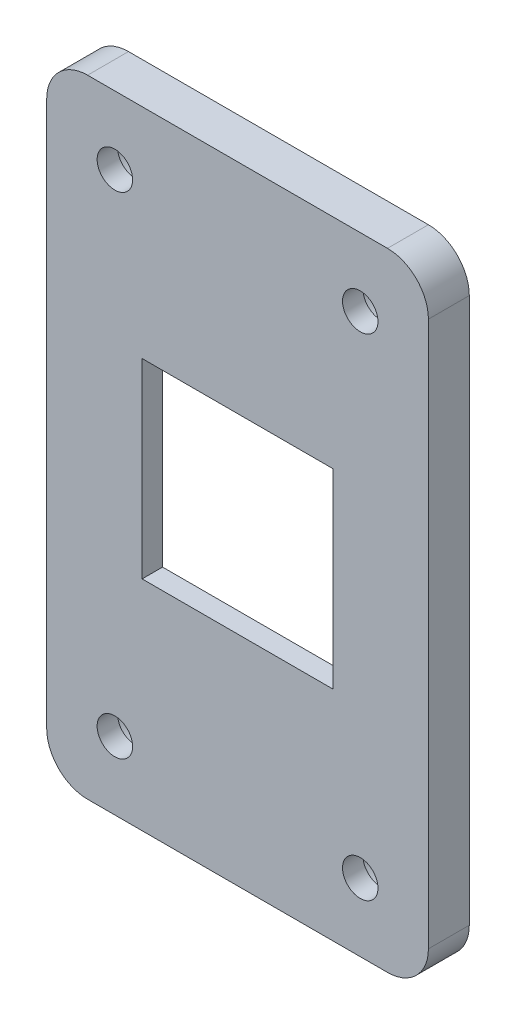
ISO-10303-21;
HEADER;
FILE_DESCRIPTION(('STEP AP214'),'2;1');
FILE_NAME('part.step','',(''),(''),'','','');
FILE_SCHEMA(('AUTOMOTIVE_DESIGN { 1 0 10303 214 1 1 1 1 }'));
ENDSEC;
DATA;
#1=APPLICATION_CONTEXT('core data for automotive mechanical design processes');
#2=APPLICATION_PROTOCOL_DEFINITION('international standard','automotive_design',2000,#1);
#3=PRODUCT_CONTEXT('',#1,'mechanical');
#4=PRODUCT('Part','Part','',(#3));
#5=PRODUCT_RELATED_PRODUCT_CATEGORY('part','',(#4));
#6=PRODUCT_DEFINITION_FORMATION('','',#4);
#7=PRODUCT_DEFINITION_CONTEXT('part definition',#1,'design');
#8=PRODUCT_DEFINITION('design','',#6,#7);
#9=PRODUCT_DEFINITION_SHAPE('','',#8);
#10=(LENGTH_UNIT() NAMED_UNIT(*) SI_UNIT(.MILLI.,.METRE.));
#11=(NAMED_UNIT(*) PLANE_ANGLE_UNIT() SI_UNIT($,.RADIAN.));
#12=(NAMED_UNIT(*) SI_UNIT($,.STERADIAN.) SOLID_ANGLE_UNIT());
#13=UNCERTAINTY_MEASURE_WITH_UNIT(LENGTH_MEASURE(1.E-05),#10,'distance_accuracy_value','');
#14=(GEOMETRIC_REPRESENTATION_CONTEXT(3) GLOBAL_UNCERTAINTY_ASSIGNED_CONTEXT((#13)) GLOBAL_UNIT_ASSIGNED_CONTEXT((#10,
#11,#12)) REPRESENTATION_CONTEXT('',''));
#15=CARTESIAN_POINT('',(0.,0.,0.));
#16=DIRECTION('',(0.,0.,1.));
#17=DIRECTION('',(1.,0.,0.));
#18=AXIS2_PLACEMENT_3D('',#15,#16,#17);
#19=CARTESIAN_POINT('',(0.,0.,0.));
#20=DIRECTION('',(0.,0.,1.));
#21=DIRECTION('',(1.,0.,0.));
#22=AXIS2_PLACEMENT_3D('',#19,#20,#21);
#23=PLANE('',#22);
#24=CARTESIAN_POINT('',(-9.,-18.,0.));
#25=DIRECTION('',(0.,0.,1.));
#26=DIRECTION('',(1.,0.,0.));
#27=AXIS2_PLACEMENT_3D('',#24,#25,#26);
#28=CIRCLE('',#27,2.5);
#29=CARTESIAN_POINT('',(-6.5,-18.,0.));
#30=VERTEX_POINT('',#29);
#31=EDGE_CURVE('E210',#30,#30,#28,.T.);
#32=ORIENTED_EDGE('',*,*,#31,.T.);
#33=EDGE_LOOP('',(#32));
#34=FACE_BOUND('',#33,.T.);
#35=CARTESIAN_POINT('',(-9.,18.,0.));
#36=DIRECTION('',(0.,0.,1.));
#37=DIRECTION('',(1.,0.,0.));
#38=AXIS2_PLACEMENT_3D('',#35,#36,#37);
#39=CIRCLE('',#38,2.5);
#40=CARTESIAN_POINT('',(-6.5,18.,0.));
#41=VERTEX_POINT('',#40);
#42=EDGE_CURVE('E219',#41,#41,#39,.T.);
#43=ORIENTED_EDGE('',*,*,#42,.T.);
#44=EDGE_LOOP('',(#43));
#45=FACE_BOUND('',#44,.T.);
#46=CARTESIAN_POINT('',(9.,18.,0.));
#47=DIRECTION('',(0.,0.,1.));
#48=DIRECTION('',(1.,0.,0.));
#49=AXIS2_PLACEMENT_3D('',#46,#47,#48);
#50=CIRCLE('',#49,2.5);
#51=CARTESIAN_POINT('',(11.5,18.,0.));
#52=VERTEX_POINT('',#51);
#53=EDGE_CURVE('E227',#52,#52,#50,.T.);
#54=ORIENTED_EDGE('',*,*,#53,.T.);
#55=EDGE_LOOP('',(#54));
#56=FACE_BOUND('',#55,.T.);
#57=DIRECTION('',(1.,0.,0.));
#58=VECTOR('',#57,1.);
#59=CARTESIAN_POINT('',(-10.,-9.99999999999999,0.));
#60=LINE('',#59,#58);
#61=CARTESIAN_POINT('',(-10.,-9.99999999999999,0.));
#62=VERTEX_POINT('',#61);
#63=CARTESIAN_POINT('',(9.99999999999999,-9.99999999999999,0.));
#64=VERTEX_POINT('',#63);
#65=EDGE_CURVE('E192',#62,#64,#60,.T.);
#66=ORIENTED_EDGE('',*,*,#65,.T.);
#67=DIRECTION('',(0.,1.,0.));
#68=VECTOR('',#67,1.);
#69=CARTESIAN_POINT('',(9.99999999999999,-9.99999999999999,0.));
#70=LINE('',#69,#68);
#71=CARTESIAN_POINT('',(9.99999999999999,10.,0.));
#72=VERTEX_POINT('',#71);
#73=EDGE_CURVE('E188',#64,#72,#70,.T.);
#74=ORIENTED_EDGE('',*,*,#73,.T.);
#75=DIRECTION('',(1.,0.,0.));
#76=VECTOR('',#75,1.);
#77=CARTESIAN_POINT('',(-10.,10.,0.));
#78=LINE('',#77,#76);
#79=CARTESIAN_POINT('',(-10.,10.,0.));
#80=VERTEX_POINT('',#79);
#81=EDGE_CURVE('E167',#80,#72,#78,.T.);
#82=ORIENTED_EDGE('',*,*,#81,.F.);
#83=DIRECTION('',(0.,1.,0.));
#84=VECTOR('',#83,1.);
#85=CARTESIAN_POINT('',(-10.,-9.99999999999999,0.));
#86=LINE('',#85,#84);
#87=EDGE_CURVE('E180',#62,#80,#86,.T.);
#88=ORIENTED_EDGE('',*,*,#87,.F.);
#89=EDGE_LOOP('',(#66,#74,#82,#88));
#90=FACE_BOUND('',#89,.T.);
#91=CARTESIAN_POINT('',(9.00000000000001,-18.,0.));
#92=DIRECTION('',(0.,0.,1.));
#93=DIRECTION('',(1.,0.,0.));
#94=AXIS2_PLACEMENT_3D('',#91,#92,#93);
#95=CIRCLE('',#94,2.5);
#96=CARTESIAN_POINT('',(11.5,-18.,0.));
#97=VERTEX_POINT('',#96);
#98=EDGE_CURVE('E214',#97,#97,#95,.T.);
#99=ORIENTED_EDGE('',*,*,#98,.T.);
#100=EDGE_LOOP('',(#99));
#101=FACE_BOUND('',#100,.T.);
#102=DIRECTION('',(1.,0.,0.));
#103=VECTOR('',#102,1.);
#104=CARTESIAN_POINT('',(0.,23.,0.));
#105=LINE('',#104,#103);
#106=CARTESIAN_POINT('',(-11.,23.,0.));
#107=VERTEX_POINT('',#106);
#108=CARTESIAN_POINT('',(11.,23.,0.));
#109=VERTEX_POINT('',#108);
#110=EDGE_CURVE('E269',#107,#109,#105,.T.);
#111=ORIENTED_EDGE('',*,*,#110,.T.);
#112=CARTESIAN_POINT('',(11.,20.,0.));
#113=DIRECTION('',(0.,0.,1.));
#114=DIRECTION('',(1.,0.,0.));
#115=AXIS2_PLACEMENT_3D('',#112,#113,#114);
#116=CIRCLE('',#115,3.);
#117=CARTESIAN_POINT('',(14.,20.,0.));
#118=VERTEX_POINT('',#117);
#119=EDGE_CURVE('E357',#109,#118,#116,.F.);
#120=ORIENTED_EDGE('',*,*,#119,.T.);
#121=DIRECTION('',(0.,-1.,0.));
#122=VECTOR('',#121,1.);
#123=CARTESIAN_POINT('',(14.,0.,0.));
#124=LINE('',#123,#122);
#125=CARTESIAN_POINT('',(14.,-20.,0.));
#126=VERTEX_POINT('',#125);
#127=EDGE_CURVE('E302',#118,#126,#124,.T.);
#128=ORIENTED_EDGE('',*,*,#127,.T.);
#129=CARTESIAN_POINT('',(11.,-20.,0.));
#130=DIRECTION('',(0.,0.,1.));
#131=DIRECTION('',(1.,0.,0.));
#132=AXIS2_PLACEMENT_3D('',#129,#130,#131);
#133=CIRCLE('',#132,3.);
#134=CARTESIAN_POINT('',(11.,-23.,0.));
#135=VERTEX_POINT('',#134);
#136=EDGE_CURVE('E354',#126,#135,#133,.F.);
#137=ORIENTED_EDGE('',*,*,#136,.T.);
#138=DIRECTION('',(1.,0.,0.));
#139=VECTOR('',#138,1.);
#140=CARTESIAN_POINT('',(0.,-23.,0.));
#141=LINE('',#140,#139);
#142=CARTESIAN_POINT('',(-11.,-23.,0.));
#143=VERTEX_POINT('',#142);
#144=EDGE_CURVE('E299',#143,#135,#141,.T.);
#145=ORIENTED_EDGE('',*,*,#144,.F.);
#146=CARTESIAN_POINT('',(-11.,-20.,0.));
#147=DIRECTION('',(0.,0.,1.));
#148=DIRECTION('',(1.,0.,0.));
#149=AXIS2_PLACEMENT_3D('',#146,#147,#148);
#150=CIRCLE('',#149,3.);
#151=CARTESIAN_POINT('',(-14.,-20.,0.));
#152=VERTEX_POINT('',#151);
#153=EDGE_CURVE('E351',#143,#152,#150,.F.);
#154=ORIENTED_EDGE('',*,*,#153,.T.);
#155=DIRECTION('',(0.,-1.,0.));
#156=VECTOR('',#155,1.);
#157=CARTESIAN_POINT('',(-14.,0.,0.));
#158=LINE('',#157,#156);
#159=CARTESIAN_POINT('',(-14.,20.,0.));
#160=VERTEX_POINT('',#159);
#161=EDGE_CURVE('E264',#160,#152,#158,.T.);
#162=ORIENTED_EDGE('',*,*,#161,.F.);
#163=CARTESIAN_POINT('',(-11.,20.,0.));
#164=DIRECTION('',(0.,0.,1.));
#165=DIRECTION('',(1.,0.,0.));
#166=AXIS2_PLACEMENT_3D('',#163,#164,#165);
#167=CIRCLE('',#166,3.);
#168=EDGE_CURVE('E348',#160,#107,#167,.F.);
#169=ORIENTED_EDGE('',*,*,#168,.T.);
#170=EDGE_LOOP('',(#111,#120,#128,#137,#145,#154,#162,#169));
#171=FACE_BOUND('',#170,.T.);
#172=ADVANCED_FACE('F47',(#34,#45,#56,#90,#101,#171),#23,.F.);
#173=CARTESIAN_POINT('',(-7.00000000000001,0.,3.));
#174=DIRECTION('',(-1.,0.,0.));
#175=DIRECTION('',(0.,0.,1.));
#176=AXIS2_PLACEMENT_3D('',#173,#174,#175);
#177=PLANE('',#176);
#178=DIRECTION('',(0.,0.,-1.));
#179=VECTOR('',#178,1.);
#180=CARTESIAN_POINT('',(-7.00000000000001,-6.99999999999999,3.));
#181=LINE('',#180,#179);
#182=CARTESIAN_POINT('',(-7.00000000000001,-6.99999999999999,3.));
#183=VERTEX_POINT('',#182);
#184=CARTESIAN_POINT('',(-7.00000000000001,-6.99999999999999,1.5));
#185=VERTEX_POINT('',#184);
#186=EDGE_CURVE('E295',#183,#185,#181,.T.);
#187=ORIENTED_EDGE('',*,*,#186,.T.);
#188=DIRECTION('',(0.,1.,0.));
#189=VECTOR('',#188,1.);
#190=CARTESIAN_POINT('',(-7.00000000000001,0.,1.5));
#191=LINE('',#190,#189);
#192=CARTESIAN_POINT('',(-7.00000000000001,7.00000000000001,1.5));
#193=VERTEX_POINT('',#192);
#194=EDGE_CURVE('E244',#185,#193,#191,.T.);
#195=ORIENTED_EDGE('',*,*,#194,.T.);
#196=DIRECTION('',(0.,0.,-1.));
#197=VECTOR('',#196,1.);
#198=CARTESIAN_POINT('',(-7.00000000000001,7.00000000000001,3.));
#199=LINE('',#198,#197);
#200=CARTESIAN_POINT('',(-7.00000000000001,7.00000000000001,3.));
#201=VERTEX_POINT('',#200);
#202=EDGE_CURVE('E320',#201,#193,#199,.T.);
#203=ORIENTED_EDGE('',*,*,#202,.F.);
#204=DIRECTION('',(0.,1.,0.));
#205=VECTOR('',#204,1.);
#206=CARTESIAN_POINT('',(-7.00000000000001,0.,3.));
#207=LINE('',#206,#205);
#208=EDGE_CURVE('E280',#183,#201,#207,.T.);
#209=ORIENTED_EDGE('',*,*,#208,.F.);
#210=EDGE_LOOP('',(#187,#195,#203,#209));
#211=FACE_BOUND('',#210,.T.);
#212=ADVANCED_FACE('F424',(#211),#177,.F.);
#213=CARTESIAN_POINT('',(0.,7.00000000000001,3.));
#214=DIRECTION('',(0.,1.,0.));
#215=DIRECTION('',(-1.,0.,0.));
#216=AXIS2_PLACEMENT_3D('',#213,#214,#215);
#217=PLANE('',#216);
#218=ORIENTED_EDGE('',*,*,#202,.T.);
#219=DIRECTION('',(1.,0.,0.));
#220=VECTOR('',#219,1.);
#221=CARTESIAN_POINT('',(0.,7.00000000000001,1.5));
#222=LINE('',#221,#220);
#223=CARTESIAN_POINT('',(6.99999999999999,7.00000000000001,1.5));
#224=VERTEX_POINT('',#223);
#225=EDGE_CURVE('E239',#193,#224,#222,.T.);
#226=ORIENTED_EDGE('',*,*,#225,.T.);
#227=DIRECTION('',(0.,0.,-1.));
#228=VECTOR('',#227,1.);
#229=CARTESIAN_POINT('',(6.99999999999999,7.00000000000001,3.));
#230=LINE('',#229,#228);
#231=CARTESIAN_POINT('',(6.99999999999999,7.00000000000001,3.));
#232=VERTEX_POINT('',#231);
#233=EDGE_CURVE('E316',#232,#224,#230,.T.);
#234=ORIENTED_EDGE('',*,*,#233,.F.);
#235=DIRECTION('',(1.,0.,0.));
#236=VECTOR('',#235,1.);
#237=CARTESIAN_POINT('',(0.,7.00000000000001,3.));
#238=LINE('',#237,#236);
#239=EDGE_CURVE('E284',#201,#232,#238,.T.);
#240=ORIENTED_EDGE('',*,*,#239,.F.);
#241=EDGE_LOOP('',(#218,#226,#234,#240));
#242=FACE_BOUND('',#241,.T.);
#243=ADVANCED_FACE('F432',(#242),#217,.F.);
#244=CARTESIAN_POINT('',(6.99999999999999,0.,3.));
#245=DIRECTION('',(-1.,0.,0.));
#246=DIRECTION('',(0.,0.,1.));
#247=AXIS2_PLACEMENT_3D('',#244,#245,#246);
#248=PLANE('',#247);
#249=DIRECTION('',(0.,1.,0.));
#250=VECTOR('',#249,1.);
#251=CARTESIAN_POINT('',(6.99999999999999,0.,1.5));
#252=LINE('',#251,#250);
#253=CARTESIAN_POINT('',(6.99999999999999,-6.99999999999999,1.5));
#254=VERTEX_POINT('',#253);
#255=EDGE_CURVE('E236',#254,#224,#252,.T.);
#256=ORIENTED_EDGE('',*,*,#255,.F.);
#257=DIRECTION('',(0.,0.,-1.));
#258=VECTOR('',#257,1.);
#259=CARTESIAN_POINT('',(6.99999999999999,-6.99999999999999,3.));
#260=LINE('',#259,#258);
#261=CARTESIAN_POINT('',(6.99999999999999,-6.99999999999999,3.));
#262=VERTEX_POINT('',#261);
#263=EDGE_CURVE('E312',#262,#254,#260,.T.);
#264=ORIENTED_EDGE('',*,*,#263,.F.);
#265=DIRECTION('',(0.,1.,0.));
#266=VECTOR('',#265,1.);
#267=CARTESIAN_POINT('',(6.99999999999999,0.,3.));
#268=LINE('',#267,#266);
#269=EDGE_CURVE('E287',#262,#232,#268,.T.);
#270=ORIENTED_EDGE('',*,*,#269,.T.);
#271=ORIENTED_EDGE('',*,*,#233,.T.);
#272=EDGE_LOOP('',(#256,#264,#270,#271));
#273=FACE_BOUND('',#272,.T.);
#274=ADVANCED_FACE('F443',(#273),#248,.T.);
#275=CARTESIAN_POINT('',(-14.,0.,3.));
#276=DIRECTION('',(1.,0.,0.));
#277=DIRECTION('',(0.,0.,-1.));
#278=AXIS2_PLACEMENT_3D('',#275,#276,#277);
#279=PLANE('',#278);
#280=ORIENTED_EDGE('',*,*,#161,.T.);
#281=DIRECTION('',(0.,0.,-1.));
#282=VECTOR('',#281,1.);
#283=CARTESIAN_POINT('',(-14.,-20.,3.));
#284=LINE('',#283,#282);
#285=CARTESIAN_POINT('',(-14.,-20.,3.));
#286=VERTEX_POINT('',#285);
#287=EDGE_CURVE('E11',#152,#286,#284,.F.);
#288=ORIENTED_EDGE('',*,*,#287,.T.);
#289=DIRECTION('',(0.,-1.,0.));
#290=VECTOR('',#289,1.);
#291=CARTESIAN_POINT('',(-14.,0.,3.));
#292=LINE('',#291,#290);
#293=CARTESIAN_POINT('',(-14.,20.,3.));
#294=VERTEX_POINT('',#293);
#295=EDGE_CURVE('E265',#294,#286,#292,.T.);
#296=ORIENTED_EDGE('',*,*,#295,.F.);
#297=DIRECTION('',(0.,0.,-1.));
#298=VECTOR('',#297,1.);
#299=CARTESIAN_POINT('',(-14.,20.,0.));
#300=LINE('',#299,#298);
#301=EDGE_CURVE('E56',#294,#160,#300,.T.);
#302=ORIENTED_EDGE('',*,*,#301,.T.);
#303=EDGE_LOOP('',(#280,#288,#296,#302));
#304=FACE_BOUND('',#303,.T.);
#305=ADVANCED_FACE('F389',(#304),#279,.F.);
#306=CARTESIAN_POINT('',(0.,-23.,3.));
#307=DIRECTION('',(0.,1.,0.));
#308=DIRECTION('',(0.,0.,1.));
#309=AXIS2_PLACEMENT_3D('',#306,#307,#308);
#310=PLANE('',#309);
#311=ORIENTED_EDGE('',*,*,#144,.T.);
#312=DIRECTION('',(0.,0.,-1.));
#313=VECTOR('',#312,1.);
#314=CARTESIAN_POINT('',(11.,-23.,3.));
#315=LINE('',#314,#313);
#316=CARTESIAN_POINT('',(11.,-23.,3.));
#317=VERTEX_POINT('',#316);
#318=EDGE_CURVE('E63',#135,#317,#315,.F.);
#319=ORIENTED_EDGE('',*,*,#318,.T.);
#320=DIRECTION('',(1.,0.,0.));
#321=VECTOR('',#320,1.);
#322=CARTESIAN_POINT('',(0.,-23.,3.));
#323=LINE('',#322,#321);
#324=CARTESIAN_POINT('',(-11.,-23.,3.));
#325=VERTEX_POINT('',#324);
#326=EDGE_CURVE('E268',#325,#317,#323,.T.);
#327=ORIENTED_EDGE('',*,*,#326,.F.);
#328=DIRECTION('',(0.,0.,-1.));
#329=VECTOR('',#328,1.);
#330=CARTESIAN_POINT('',(-11.,-23.,3.));
#331=LINE('',#330,#329);
#332=EDGE_CURVE('E378',#325,#143,#331,.T.);
#333=ORIENTED_EDGE('',*,*,#332,.T.);
#334=EDGE_LOOP('',(#311,#319,#327,#333));
#335=FACE_BOUND('',#334,.T.);
#336=ADVANCED_FACE('F399',(#335),#310,.F.);
#337=CARTESIAN_POINT('',(14.,0.,3.));
#338=DIRECTION('',(1.,0.,0.));
#339=DIRECTION('',(0.,0.,-1.));
#340=AXIS2_PLACEMENT_3D('',#337,#338,#339);
#341=PLANE('',#340);
#342=ORIENTED_EDGE('',*,*,#127,.F.);
#343=DIRECTION('',(0.,0.,-1.));
#344=VECTOR('',#343,1.);
#345=CARTESIAN_POINT('',(14.,20.,3.));
#346=LINE('',#345,#344);
#347=CARTESIAN_POINT('',(14.,20.,3.));
#348=VERTEX_POINT('',#347);
#349=EDGE_CURVE('E364',#118,#348,#346,.F.);
#350=ORIENTED_EDGE('',*,*,#349,.T.);
#351=DIRECTION('',(0.,-1.,0.));
#352=VECTOR('',#351,1.);
#353=CARTESIAN_POINT('',(14.,0.,3.));
#354=LINE('',#353,#352);
#355=CARTESIAN_POINT('',(14.,-20.,3.));
#356=VERTEX_POINT('',#355);
#357=EDGE_CURVE('E272',#348,#356,#354,.T.);
#358=ORIENTED_EDGE('',*,*,#357,.T.);
#359=DIRECTION('',(0.,0.,-1.));
#360=VECTOR('',#359,1.);
#361=CARTESIAN_POINT('',(14.,-20.,0.));
#362=LINE('',#361,#360);
#363=EDGE_CURVE('E360',#356,#126,#362,.T.);
#364=ORIENTED_EDGE('',*,*,#363,.T.);
#365=EDGE_LOOP('',(#342,#350,#358,#364));
#366=FACE_BOUND('',#365,.T.);
#367=ADVANCED_FACE('F409',(#366),#341,.T.);
#368=CARTESIAN_POINT('',(0.,23.,3.));
#369=DIRECTION('',(0.,1.,0.));
#370=DIRECTION('',(0.,0.,1.));
#371=AXIS2_PLACEMENT_3D('',#368,#369,#370);
#372=PLANE('',#371);
#373=DIRECTION('',(1.,0.,0.));
#374=VECTOR('',#373,1.);
#375=CARTESIAN_POINT('',(0.,23.,3.));
#376=LINE('',#375,#374);
#377=CARTESIAN_POINT('',(-11.,23.,3.));
#378=VERTEX_POINT('',#377);
#379=CARTESIAN_POINT('',(11.,23.,3.));
#380=VERTEX_POINT('',#379);
#381=EDGE_CURVE('E276',#378,#380,#376,.T.);
#382=ORIENTED_EDGE('',*,*,#381,.T.);
#383=DIRECTION('',(0.,0.,-1.));
#384=VECTOR('',#383,1.);
#385=CARTESIAN_POINT('',(11.,23.,3.));
#386=LINE('',#385,#384);
#387=EDGE_CURVE('E344',#380,#109,#386,.T.);
#388=ORIENTED_EDGE('',*,*,#387,.T.);
#389=ORIENTED_EDGE('',*,*,#110,.F.);
#390=DIRECTION('',(0.,0.,-1.));
#391=VECTOR('',#390,1.);
#392=CARTESIAN_POINT('',(-11.,23.,3.));
#393=LINE('',#392,#391);
#394=EDGE_CURVE('E341',#107,#378,#393,.F.);
#395=ORIENTED_EDGE('',*,*,#394,.T.);
#396=EDGE_LOOP('',(#382,#388,#389,#395));
#397=FACE_BOUND('',#396,.T.);
#398=ADVANCED_FACE('F416',(#397),#372,.T.);
#399=CARTESIAN_POINT('',(0.,-6.99999999999999,3.));
#400=DIRECTION('',(0.,1.,0.));
#401=DIRECTION('',(-1.,0.,0.));
#402=AXIS2_PLACEMENT_3D('',#399,#400,#401);
#403=PLANE('',#402);
#404=DIRECTION('',(1.,0.,0.));
#405=VECTOR('',#404,1.);
#406=CARTESIAN_POINT('',(0.,-6.99999999999999,1.5));
#407=LINE('',#406,#405);
#408=EDGE_CURVE('E324',#185,#254,#407,.T.);
#409=ORIENTED_EDGE('',*,*,#408,.F.);
#410=ORIENTED_EDGE('',*,*,#186,.F.);
#411=DIRECTION('',(1.,0.,0.));
#412=VECTOR('',#411,1.);
#413=CARTESIAN_POINT('',(0.,-6.99999999999999,3.));
#414=LINE('',#413,#412);
#415=EDGE_CURVE('E291',#183,#262,#414,.T.);
#416=ORIENTED_EDGE('',*,*,#415,.T.);
#417=ORIENTED_EDGE('',*,*,#263,.T.);
#418=EDGE_LOOP('',(#409,#410,#416,#417));
#419=FACE_BOUND('',#418,.T.);
#420=ADVANCED_FACE('F439',(#419),#403,.T.);
#421=CARTESIAN_POINT('',(0.,0.,3.));
#422=DIRECTION('',(0.,0.,1.));
#423=DIRECTION('',(1.,0.,0.));
#424=AXIS2_PLACEMENT_3D('',#421,#422,#423);
#425=PLANE('',#424);
#426=CARTESIAN_POINT('',(9.00000000000001,-18.,3.));
#427=DIRECTION('',(0.,0.,-1.));
#428=DIRECTION('',(-1.,0.,0.));
#429=AXIS2_PLACEMENT_3D('',#426,#427,#428);
#430=CIRCLE('',#429,1.3);
#431=CARTESIAN_POINT('',(7.70000000000001,-18.,3.));
#432=VERTEX_POINT('',#431);
#433=EDGE_CURVE('E248',#432,#432,#430,.T.);
#434=ORIENTED_EDGE('',*,*,#433,.T.);
#435=EDGE_LOOP('',(#434));
#436=FACE_BOUND('',#435,.T.);
#437=CARTESIAN_POINT('',(-9.,-18.,3.));
#438=DIRECTION('',(0.,0.,-1.));
#439=DIRECTION('',(-1.,0.,0.));
#440=AXIS2_PLACEMENT_3D('',#437,#438,#439);
#441=CIRCLE('',#440,1.3);
#442=CARTESIAN_POINT('',(-10.3,-18.,3.));
#443=VERTEX_POINT('',#442);
#444=EDGE_CURVE('E252',#443,#443,#441,.T.);
#445=ORIENTED_EDGE('',*,*,#444,.T.);
#446=EDGE_LOOP('',(#445));
#447=FACE_BOUND('',#446,.T.);
#448=CARTESIAN_POINT('',(9.,18.,3.));
#449=DIRECTION('',(0.,0.,-1.));
#450=DIRECTION('',(-1.,0.,0.));
#451=AXIS2_PLACEMENT_3D('',#448,#449,#450);
#452=CIRCLE('',#451,1.3);
#453=CARTESIAN_POINT('',(7.7,18.,3.));
#454=VERTEX_POINT('',#453);
#455=EDGE_CURVE('E256',#454,#454,#452,.T.);
#456=ORIENTED_EDGE('',*,*,#455,.T.);
#457=EDGE_LOOP('',(#456));
#458=FACE_BOUND('',#457,.T.);
#459=CARTESIAN_POINT('',(-9.,18.,3.));
#460=DIRECTION('',(0.,0.,-1.));
#461=DIRECTION('',(-1.,0.,0.));
#462=AXIS2_PLACEMENT_3D('',#459,#460,#461);
#463=CIRCLE('',#462,1.3);
#464=CARTESIAN_POINT('',(-10.3,18.,3.));
#465=VERTEX_POINT('',#464);
#466=EDGE_CURVE('E260',#465,#465,#463,.T.);
#467=ORIENTED_EDGE('',*,*,#466,.T.);
#468=EDGE_LOOP('',(#467));
#469=FACE_BOUND('',#468,.T.);
#470=ORIENTED_EDGE('',*,*,#357,.F.);
#471=CARTESIAN_POINT('',(11.,20.,3.));
#472=DIRECTION('',(0.,0.,1.));
#473=DIRECTION('',(1.,0.,0.));
#474=AXIS2_PLACEMENT_3D('',#471,#472,#473);
#475=CIRCLE('',#474,3.);
#476=EDGE_CURVE('E375',#348,#380,#475,.T.);
#477=ORIENTED_EDGE('',*,*,#476,.T.);
#478=ORIENTED_EDGE('',*,*,#381,.F.);
#479=CARTESIAN_POINT('',(-11.,20.,3.));
#480=DIRECTION('',(0.,0.,1.));
#481=DIRECTION('',(1.,0.,0.));
#482=AXIS2_PLACEMENT_3D('',#479,#480,#481);
#483=CIRCLE('',#482,3.);
#484=EDGE_CURVE('E367',#378,#294,#483,.T.);
#485=ORIENTED_EDGE('',*,*,#484,.T.);
#486=ORIENTED_EDGE('',*,*,#295,.T.);
#487=CARTESIAN_POINT('',(-11.,-20.,3.));
#488=DIRECTION('',(0.,0.,1.));
#489=DIRECTION('',(1.,0.,0.));
#490=AXIS2_PLACEMENT_3D('',#487,#488,#489);
#491=CIRCLE('',#490,3.);
#492=EDGE_CURVE('E70',#286,#325,#491,.T.);
#493=ORIENTED_EDGE('',*,*,#492,.T.);
#494=ORIENTED_EDGE('',*,*,#326,.T.);
#495=CARTESIAN_POINT('',(11.,-20.,3.));
#496=DIRECTION('',(0.,0.,1.));
#497=DIRECTION('',(1.,0.,0.));
#498=AXIS2_PLACEMENT_3D('',#495,#496,#497);
#499=CIRCLE('',#498,3.);
#500=EDGE_CURVE('E372',#317,#356,#499,.T.);
#501=ORIENTED_EDGE('',*,*,#500,.T.);
#502=EDGE_LOOP('',(#470,#477,#478,#485,#486,#493,#494,#501));
#503=FACE_BOUND('',#502,.T.);
#504=ORIENTED_EDGE('',*,*,#208,.T.);
#505=ORIENTED_EDGE('',*,*,#239,.T.);
#506=ORIENTED_EDGE('',*,*,#269,.F.);
#507=ORIENTED_EDGE('',*,*,#415,.F.);
#508=EDGE_LOOP('',(#504,#505,#506,#507));
#509=FACE_BOUND('',#508,.T.);
#510=ADVANCED_FACE('F402',(#436,#447,#458,#469,#503,#509),#425,.T.);
#511=CARTESIAN_POINT('',(-9.,18.,0.));
#512=DIRECTION('',(0.,0.,-1.));
#513=DIRECTION('',(-1.,0.,0.));
#514=AXIS2_PLACEMENT_3D('',#511,#512,#513);
#515=CYLINDRICAL_SURFACE('',#514,1.3);
#516=CARTESIAN_POINT('',(-9.,18.,1.5));
#517=DIRECTION('',(0.,0.,1.));
#518=DIRECTION('',(1.,0.,0.));
#519=AXIS2_PLACEMENT_3D('',#516,#517,#518);
#520=CIRCLE('',#519,1.3);
#521=CARTESIAN_POINT('',(-7.7,18.,1.5));
#522=VERTEX_POINT('',#521);
#523=EDGE_CURVE('E240',#522,#522,#520,.F.);
#524=ORIENTED_EDGE('',*,*,#523,.T.);
#525=EDGE_LOOP('',(#524));
#526=FACE_BOUND('',#525,.T.);
#527=ORIENTED_EDGE('',*,*,#466,.F.);
#528=EDGE_LOOP('',(#527));
#529=FACE_BOUND('',#528,.T.);
#530=ADVANCED_FACE('F619',(#526,#529),#515,.F.);
#531=CARTESIAN_POINT('',(9.,18.,0.));
#532=DIRECTION('',(0.,0.,-1.));
#533=DIRECTION('',(-1.,0.,0.));
#534=AXIS2_PLACEMENT_3D('',#531,#532,#533);
#535=CYLINDRICAL_SURFACE('',#534,1.3);
#536=CARTESIAN_POINT('',(9.,18.,1.5));
#537=DIRECTION('',(0.,0.,1.));
#538=DIRECTION('',(1.,0.,0.));
#539=AXIS2_PLACEMENT_3D('',#536,#537,#538);
#540=CIRCLE('',#539,1.3);
#541=CARTESIAN_POINT('',(10.3,18.,1.5));
#542=VERTEX_POINT('',#541);
#543=EDGE_CURVE('E332',#542,#542,#540,.F.);
#544=ORIENTED_EDGE('',*,*,#543,.T.);
#545=EDGE_LOOP('',(#544));
#546=FACE_BOUND('',#545,.T.);
#547=ORIENTED_EDGE('',*,*,#455,.F.);
#548=EDGE_LOOP('',(#547));
#549=FACE_BOUND('',#548,.T.);
#550=ADVANCED_FACE('F610',(#546,#549),#535,.F.);
#551=CARTESIAN_POINT('',(-9.,-18.,0.));
#552=DIRECTION('',(0.,0.,-1.));
#553=DIRECTION('',(-1.,0.,0.));
#554=AXIS2_PLACEMENT_3D('',#551,#552,#553);
#555=CYLINDRICAL_SURFACE('',#554,1.3);
#556=CARTESIAN_POINT('',(-9.,-18.,1.5));
#557=DIRECTION('',(0.,0.,1.));
#558=DIRECTION('',(1.,0.,0.));
#559=AXIS2_PLACEMENT_3D('',#556,#557,#558);
#560=CIRCLE('',#559,1.3);
#561=CARTESIAN_POINT('',(-7.7,-18.,1.5));
#562=VERTEX_POINT('',#561);
#563=EDGE_CURVE('E328',#562,#562,#560,.F.);
#564=ORIENTED_EDGE('',*,*,#563,.T.);
#565=EDGE_LOOP('',(#564));
#566=FACE_BOUND('',#565,.T.);
#567=ORIENTED_EDGE('',*,*,#444,.F.);
#568=EDGE_LOOP('',(#567));
#569=FACE_BOUND('',#568,.T.);
#570=ADVANCED_FACE('F601',(#566,#569),#555,.F.);
#571=CARTESIAN_POINT('',(9.00000000000001,-18.,0.));
#572=DIRECTION('',(0.,0.,-1.));
#573=DIRECTION('',(-1.,0.,0.));
#574=AXIS2_PLACEMENT_3D('',#571,#572,#573);
#575=CYLINDRICAL_SURFACE('',#574,1.3);
#576=CARTESIAN_POINT('',(9.00000000000001,-18.,1.5));
#577=DIRECTION('',(0.,0.,1.));
#578=DIRECTION('',(1.,0.,0.));
#579=AXIS2_PLACEMENT_3D('',#576,#577,#578);
#580=CIRCLE('',#579,1.3);
#581=CARTESIAN_POINT('',(10.3,-18.,1.5));
#582=VERTEX_POINT('',#581);
#583=EDGE_CURVE('E232',#582,#582,#580,.F.);
#584=ORIENTED_EDGE('',*,*,#583,.T.);
#585=EDGE_LOOP('',(#584));
#586=FACE_BOUND('',#585,.T.);
#587=ORIENTED_EDGE('',*,*,#433,.F.);
#588=EDGE_LOOP('',(#587));
#589=FACE_BOUND('',#588,.T.);
#590=ADVANCED_FACE('F592',(#586,#589),#575,.F.);
#591=CARTESIAN_POINT('',(0.,0.,1.5));
#592=DIRECTION('',(0.,0.,1.));
#593=DIRECTION('',(1.,0.,0.));
#594=AXIS2_PLACEMENT_3D('',#591,#592,#593);
#595=PLANE('',#594);
#596=CARTESIAN_POINT('',(9.00000000000001,-18.,1.5));
#597=DIRECTION('',(0.,0.,1.));
#598=DIRECTION('',(1.,0.,0.));
#599=AXIS2_PLACEMENT_3D('',#596,#597,#598);
#600=CIRCLE('',#599,2.5);
#601=CARTESIAN_POINT('',(11.5,-18.,1.5));
#602=VERTEX_POINT('',#601);
#603=EDGE_CURVE('E228',#602,#602,#600,.T.);
#604=ORIENTED_EDGE('',*,*,#603,.F.);
#605=EDGE_LOOP('',(#604));
#606=FACE_BOUND('',#605,.T.);
#607=ORIENTED_EDGE('',*,*,#583,.F.);
#608=EDGE_LOOP('',(#607));
#609=FACE_BOUND('',#608,.T.);
#610=ADVANCED_FACE('F583',(#606,#609),#595,.F.);
#611=CARTESIAN_POINT('',(9.00000000000001,-18.,1.5));
#612=DIRECTION('',(0.,0.,-1.));
#613=DIRECTION('',(-1.,0.,0.));
#614=AXIS2_PLACEMENT_3D('',#611,#612,#613);
#615=CYLINDRICAL_SURFACE('',#614,2.5);
#616=ORIENTED_EDGE('',*,*,#603,.T.);
#617=EDGE_LOOP('',(#616));
#618=FACE_BOUND('',#617,.T.);
#619=ORIENTED_EDGE('',*,*,#98,.F.);
#620=EDGE_LOOP('',(#619));
#621=FACE_BOUND('',#620,.T.);
#622=ADVANCED_FACE('F574',(#618,#621),#615,.F.);
#623=CARTESIAN_POINT('',(0.,0.,1.5));
#624=DIRECTION('',(0.,0.,1.));
#625=DIRECTION('',(1.,0.,0.));
#626=AXIS2_PLACEMENT_3D('',#623,#624,#625);
#627=PLANE('',#626);
#628=CARTESIAN_POINT('',(-9.,-18.,1.5));
#629=DIRECTION('',(0.,0.,1.));
#630=DIRECTION('',(1.,0.,0.));
#631=AXIS2_PLACEMENT_3D('',#628,#629,#630);
#632=CIRCLE('',#631,2.5);
#633=CARTESIAN_POINT('',(-6.5,-18.,1.5));
#634=VERTEX_POINT('',#633);
#635=EDGE_CURVE('E215',#634,#634,#632,.T.);
#636=ORIENTED_EDGE('',*,*,#635,.F.);
#637=EDGE_LOOP('',(#636));
#638=FACE_BOUND('',#637,.T.);
#639=ORIENTED_EDGE('',*,*,#563,.F.);
#640=EDGE_LOOP('',(#639));
#641=FACE_BOUND('',#640,.T.);
#642=ADVANCED_FACE('F565',(#638,#641),#627,.F.);
#643=CARTESIAN_POINT('',(-9.,-18.,1.5));
#644=DIRECTION('',(0.,0.,-1.));
#645=DIRECTION('',(-1.,0.,0.));
#646=AXIS2_PLACEMENT_3D('',#643,#644,#645);
#647=CYLINDRICAL_SURFACE('',#646,2.5);
#648=ORIENTED_EDGE('',*,*,#635,.T.);
#649=EDGE_LOOP('',(#648));
#650=FACE_BOUND('',#649,.T.);
#651=ORIENTED_EDGE('',*,*,#31,.F.);
#652=EDGE_LOOP('',(#651));
#653=FACE_BOUND('',#652,.T.);
#654=ADVANCED_FACE('F556',(#650,#653),#647,.F.);
#655=CARTESIAN_POINT('',(0.,0.,1.5));
#656=DIRECTION('',(0.,0.,1.));
#657=DIRECTION('',(1.,0.,0.));
#658=AXIS2_PLACEMENT_3D('',#655,#656,#657);
#659=PLANE('',#658);
#660=CARTESIAN_POINT('',(9.,18.,1.5));
#661=DIRECTION('',(0.,0.,1.));
#662=DIRECTION('',(1.,0.,0.));
#663=AXIS2_PLACEMENT_3D('',#660,#661,#662);
#664=CIRCLE('',#663,2.5);
#665=CARTESIAN_POINT('',(11.5,18.,1.5));
#666=VERTEX_POINT('',#665);
#667=EDGE_CURVE('E198',#666,#666,#664,.T.);
#668=ORIENTED_EDGE('',*,*,#667,.F.);
#669=EDGE_LOOP('',(#668));
#670=FACE_BOUND('',#669,.T.);
#671=ORIENTED_EDGE('',*,*,#543,.F.);
#672=EDGE_LOOP('',(#671));
#673=FACE_BOUND('',#672,.T.);
#674=ADVANCED_FACE('F547',(#670,#673),#659,.F.);
#675=CARTESIAN_POINT('',(9.,18.,1.5));
#676=DIRECTION('',(0.,0.,-1.));
#677=DIRECTION('',(-1.,0.,0.));
#678=AXIS2_PLACEMENT_3D('',#675,#676,#677);
#679=CYLINDRICAL_SURFACE('',#678,2.5);
#680=ORIENTED_EDGE('',*,*,#667,.T.);
#681=EDGE_LOOP('',(#680));
#682=FACE_BOUND('',#681,.T.);
#683=ORIENTED_EDGE('',*,*,#53,.F.);
#684=EDGE_LOOP('',(#683));
#685=FACE_BOUND('',#684,.T.);
#686=ADVANCED_FACE('F538',(#682,#685),#679,.F.);
#687=CARTESIAN_POINT('',(0.,0.,1.5));
#688=DIRECTION('',(0.,0.,1.));
#689=DIRECTION('',(1.,0.,0.));
#690=AXIS2_PLACEMENT_3D('',#687,#688,#689);
#691=PLANE('',#690);
#692=CARTESIAN_POINT('',(-9.,18.,1.5));
#693=DIRECTION('',(0.,0.,1.));
#694=DIRECTION('',(1.,0.,0.));
#695=AXIS2_PLACEMENT_3D('',#692,#693,#694);
#696=CIRCLE('',#695,2.5);
#697=CARTESIAN_POINT('',(-6.5,18.,1.5));
#698=VERTEX_POINT('',#697);
#699=EDGE_CURVE('E223',#698,#698,#696,.T.);
#700=ORIENTED_EDGE('',*,*,#699,.F.);
#701=EDGE_LOOP('',(#700));
#702=FACE_BOUND('',#701,.T.);
#703=ORIENTED_EDGE('',*,*,#523,.F.);
#704=EDGE_LOOP('',(#703));
#705=FACE_BOUND('',#704,.T.);
#706=ADVANCED_FACE('F529',(#702,#705),#691,.F.);
#707=CARTESIAN_POINT('',(-9.,18.,1.5));
#708=DIRECTION('',(0.,0.,-1.));
#709=DIRECTION('',(-1.,0.,0.));
#710=AXIS2_PLACEMENT_3D('',#707,#708,#709);
#711=CYLINDRICAL_SURFACE('',#710,2.5);
#712=ORIENTED_EDGE('',*,*,#699,.T.);
#713=EDGE_LOOP('',(#712));
#714=FACE_BOUND('',#713,.T.);
#715=ORIENTED_EDGE('',*,*,#42,.F.);
#716=EDGE_LOOP('',(#715));
#717=FACE_BOUND('',#716,.T.);
#718=ADVANCED_FACE('F520',(#714,#717),#711,.F.);
#719=CARTESIAN_POINT('',(0.,0.,1.5));
#720=DIRECTION('',(0.,0.,1.));
#721=DIRECTION('',(1.,0.,0.));
#722=AXIS2_PLACEMENT_3D('',#719,#720,#721);
#723=PLANE('',#722);
#724=DIRECTION('',(1.,0.,0.));
#725=VECTOR('',#724,1.);
#726=CARTESIAN_POINT('',(-10.,-9.99999999999999,1.5));
#727=LINE('',#726,#725);
#728=CARTESIAN_POINT('',(-10.,-9.99999999999999,1.5));
#729=VERTEX_POINT('',#728);
#730=CARTESIAN_POINT('',(9.99999999999999,-9.99999999999999,1.5));
#731=VERTEX_POINT('',#730);
#732=EDGE_CURVE('E185',#729,#731,#727,.T.);
#733=ORIENTED_EDGE('',*,*,#732,.F.);
#734=DIRECTION('',(0.,1.,0.));
#735=VECTOR('',#734,1.);
#736=CARTESIAN_POINT('',(-10.,-9.99999999999999,1.5));
#737=LINE('',#736,#735);
#738=CARTESIAN_POINT('',(-10.,10.,1.5));
#739=VERTEX_POINT('',#738);
#740=EDGE_CURVE('E199',#729,#739,#737,.T.);
#741=ORIENTED_EDGE('',*,*,#740,.T.);
#742=DIRECTION('',(1.,0.,0.));
#743=VECTOR('',#742,1.);
#744=CARTESIAN_POINT('',(-10.,10.,1.5));
#745=LINE('',#744,#743);
#746=CARTESIAN_POINT('',(9.99999999999999,10.,1.5));
#747=VERTEX_POINT('',#746);
#748=EDGE_CURVE('E170',#739,#747,#745,.T.);
#749=ORIENTED_EDGE('',*,*,#748,.T.);
#750=DIRECTION('',(0.,1.,0.));
#751=VECTOR('',#750,1.);
#752=CARTESIAN_POINT('',(9.99999999999999,-9.99999999999999,1.5));
#753=LINE('',#752,#751);
#754=EDGE_CURVE('E204',#731,#747,#753,.T.);
#755=ORIENTED_EDGE('',*,*,#754,.F.);
#756=EDGE_LOOP('',(#733,#741,#749,#755));
#757=FACE_BOUND('',#756,.T.);
#758=ORIENTED_EDGE('',*,*,#408,.T.);
#759=ORIENTED_EDGE('',*,*,#255,.T.);
#760=ORIENTED_EDGE('',*,*,#225,.F.);
#761=ORIENTED_EDGE('',*,*,#194,.F.);
#762=EDGE_LOOP('',(#758,#759,#760,#761));
#763=FACE_BOUND('',#762,.T.);
#764=ADVANCED_FACE('F511',(#757,#763),#723,.F.);
#765=CARTESIAN_POINT('',(-10.,-9.99999999999999,1.5));
#766=DIRECTION('',(0.,1.,0.));
#767=DIRECTION('',(-1.,0.,0.));
#768=AXIS2_PLACEMENT_3D('',#765,#766,#767);
#769=PLANE('',#768);
#770=ORIENTED_EDGE('',*,*,#65,.F.);
#771=DIRECTION('',(0.,0.,-1.));
#772=VECTOR('',#771,1.);
#773=CARTESIAN_POINT('',(-10.,-9.99999999999999,1.5));
#774=LINE('',#773,#772);
#775=EDGE_CURVE('E175',#729,#62,#774,.T.);
#776=ORIENTED_EDGE('',*,*,#775,.F.);
#777=ORIENTED_EDGE('',*,*,#732,.T.);
#778=DIRECTION('',(0.,0.,-1.));
#779=VECTOR('',#778,1.);
#780=CARTESIAN_POINT('',(9.99999999999999,-9.99999999999999,1.5));
#781=LINE('',#780,#779);
#782=EDGE_CURVE('E745',#731,#64,#781,.T.);
#783=ORIENTED_EDGE('',*,*,#782,.T.);
#784=EDGE_LOOP('',(#770,#776,#777,#783));
#785=FACE_BOUND('',#784,.T.);
#786=ADVANCED_FACE('F502',(#785),#769,.T.);
#787=CARTESIAN_POINT('',(9.99999999999999,-9.99999999999999,1.5));
#788=DIRECTION('',(-1.,0.,0.));
#789=DIRECTION('',(0.,0.,1.));
#790=AXIS2_PLACEMENT_3D('',#787,#788,#789);
#791=PLANE('',#790);
#792=ORIENTED_EDGE('',*,*,#73,.F.);
#793=ORIENTED_EDGE('',*,*,#782,.F.);
#794=ORIENTED_EDGE('',*,*,#754,.T.);
#795=DIRECTION('',(0.,0.,-1.));
#796=VECTOR('',#795,1.);
#797=CARTESIAN_POINT('',(9.99999999999999,10.,1.5));
#798=LINE('',#797,#796);
#799=EDGE_CURVE('E176',#747,#72,#798,.T.);
#800=ORIENTED_EDGE('',*,*,#799,.T.);
#801=EDGE_LOOP('',(#792,#793,#794,#800));
#802=FACE_BOUND('',#801,.T.);
#803=ADVANCED_FACE('F494',(#802),#791,.T.);
#804=CARTESIAN_POINT('',(-10.,10.,1.5));
#805=DIRECTION('',(0.,1.,0.));
#806=DIRECTION('',(0.,0.,1.));
#807=AXIS2_PLACEMENT_3D('',#804,#805,#806);
#808=PLANE('',#807);
#809=ORIENTED_EDGE('',*,*,#81,.T.);
#810=ORIENTED_EDGE('',*,*,#799,.F.);
#811=ORIENTED_EDGE('',*,*,#748,.F.);
#812=DIRECTION('',(0.,0.,-1.));
#813=VECTOR('',#812,1.);
#814=CARTESIAN_POINT('',(-10.,10.,1.5));
#815=LINE('',#814,#813);
#816=EDGE_CURVE('E162',#739,#80,#815,.T.);
#817=ORIENTED_EDGE('',*,*,#816,.T.);
#818=EDGE_LOOP('',(#809,#810,#811,#817));
#819=FACE_BOUND('',#818,.T.);
#820=ADVANCED_FACE('F164',(#819),#808,.F.);
#821=CARTESIAN_POINT('',(-10.,-9.99999999999999,1.5));
#822=DIRECTION('',(-1.,0.,0.));
#823=DIRECTION('',(0.,0.,1.));
#824=AXIS2_PLACEMENT_3D('',#821,#822,#823);
#825=PLANE('',#824);
#826=ORIENTED_EDGE('',*,*,#87,.T.);
#827=ORIENTED_EDGE('',*,*,#816,.F.);
#828=ORIENTED_EDGE('',*,*,#740,.F.);
#829=ORIENTED_EDGE('',*,*,#775,.T.);
#830=EDGE_LOOP('',(#826,#827,#828,#829));
#831=FACE_BOUND('',#830,.T.);
#832=ADVANCED_FACE('F181',(#831),#825,.F.);
#833=CARTESIAN_POINT('',(11.,20.,3.));
#834=DIRECTION('',(0.,0.,-1.));
#835=DIRECTION('',(-1.,0.,0.));
#836=AXIS2_PLACEMENT_3D('',#833,#834,#835);
#837=CYLINDRICAL_SURFACE('',#836,3.);
#838=ORIENTED_EDGE('',*,*,#476,.F.);
#839=ORIENTED_EDGE('',*,*,#349,.F.);
#840=ORIENTED_EDGE('',*,*,#119,.F.);
#841=ORIENTED_EDGE('',*,*,#387,.F.);
#842=EDGE_LOOP('',(#838,#839,#840,#841));
#843=FACE_BOUND('',#842,.T.);
#844=ADVANCED_FACE('F414',(#843),#837,.T.);
#845=CARTESIAN_POINT('',(11.,-20.,3.));
#846=DIRECTION('',(0.,0.,1.));
#847=DIRECTION('',(1.,0.,0.));
#848=AXIS2_PLACEMENT_3D('',#845,#846,#847);
#849=CYLINDRICAL_SURFACE('',#848,3.);
#850=ORIENTED_EDGE('',*,*,#500,.F.);
#851=ORIENTED_EDGE('',*,*,#318,.F.);
#852=ORIENTED_EDGE('',*,*,#136,.F.);
#853=ORIENTED_EDGE('',*,*,#363,.F.);
#854=EDGE_LOOP('',(#850,#851,#852,#853));
#855=FACE_BOUND('',#854,.T.);
#856=ADVANCED_FACE('F406',(#855),#849,.T.);
#857=CARTESIAN_POINT('',(-11.,-20.,3.));
#858=DIRECTION('',(0.,0.,-1.));
#859=DIRECTION('',(-1.,0.,0.));
#860=AXIS2_PLACEMENT_3D('',#857,#858,#859);
#861=CYLINDRICAL_SURFACE('',#860,3.);
#862=ORIENTED_EDGE('',*,*,#492,.F.);
#863=ORIENTED_EDGE('',*,*,#287,.F.);
#864=ORIENTED_EDGE('',*,*,#153,.F.);
#865=ORIENTED_EDGE('',*,*,#332,.F.);
#866=EDGE_LOOP('',(#862,#863,#864,#865));
#867=FACE_BOUND('',#866,.T.);
#868=ADVANCED_FACE('F398',(#867),#861,.T.);
#869=CARTESIAN_POINT('',(-11.,20.,3.));
#870=DIRECTION('',(0.,0.,1.));
#871=DIRECTION('',(1.,0.,0.));
#872=AXIS2_PLACEMENT_3D('',#869,#870,#871);
#873=CYLINDRICAL_SURFACE('',#872,3.);
#874=ORIENTED_EDGE('',*,*,#484,.F.);
#875=ORIENTED_EDGE('',*,*,#394,.F.);
#876=ORIENTED_EDGE('',*,*,#168,.F.);
#877=ORIENTED_EDGE('',*,*,#301,.F.);
#878=EDGE_LOOP('',(#874,#875,#876,#877));
#879=FACE_BOUND('',#878,.T.);
#880=ADVANCED_FACE('F49',(#879),#873,.T.);
#881=CLOSED_SHELL('',(#172,#212,#243,#274,#305,#336,#367,#398,#420,#510,#530,#550,#570,#590,
#610,#622,#642,#654,#674,#686,#706,#718,#764,#786,#803,#820,#832,#844,#856,#868,#880));
#882=MANIFOLD_SOLID_BREP('B2',#881);
#883=ADVANCED_BREP_SHAPE_REPRESENTATION('',(#18,#882),#14);
#884=SHAPE_DEFINITION_REPRESENTATION(#9,#883);
ENDSEC;
END-ISO-10303-21;
